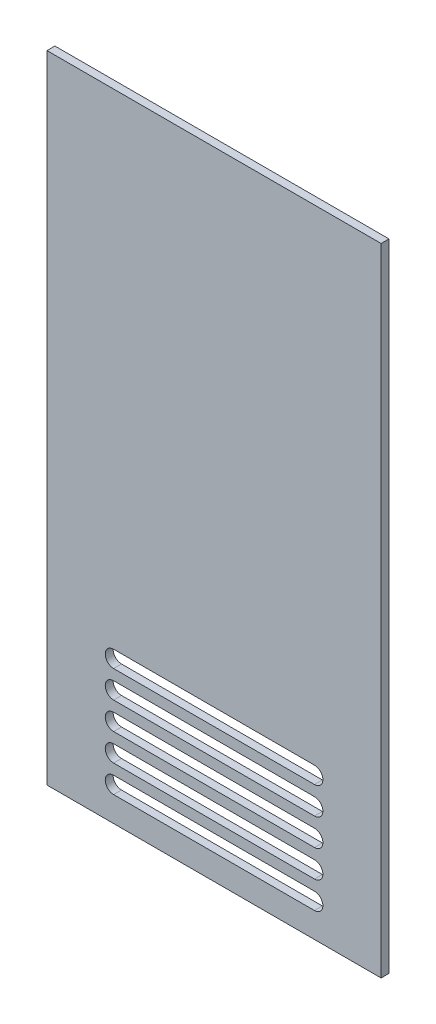
ISO-10303-21;
HEADER;
FILE_DESCRIPTION(('STEP AP214'),'2;1');
FILE_NAME('part.step','',(''),(''),'','','');
FILE_SCHEMA(('AUTOMOTIVE_DESIGN { 1 0 10303 214 1 1 1 1 }'));
ENDSEC;
DATA;
#1=APPLICATION_CONTEXT('core data for automotive mechanical design processes');
#2=APPLICATION_PROTOCOL_DEFINITION('international standard','automotive_design',2000,#1);
#3=PRODUCT_CONTEXT('',#1,'mechanical');
#4=PRODUCT('Part','Part','',(#3));
#5=PRODUCT_RELATED_PRODUCT_CATEGORY('part','',(#4));
#6=PRODUCT_DEFINITION_FORMATION('','',#4);
#7=PRODUCT_DEFINITION_CONTEXT('part definition',#1,'design');
#8=PRODUCT_DEFINITION('design','',#6,#7);
#9=PRODUCT_DEFINITION_SHAPE('','',#8);
#10=(LENGTH_UNIT() NAMED_UNIT(*) SI_UNIT(.MILLI.,.METRE.));
#11=(NAMED_UNIT(*) PLANE_ANGLE_UNIT() SI_UNIT($,.RADIAN.));
#12=(NAMED_UNIT(*) SI_UNIT($,.STERADIAN.) SOLID_ANGLE_UNIT());
#13=UNCERTAINTY_MEASURE_WITH_UNIT(LENGTH_MEASURE(1.E-05),#10,'distance_accuracy_value','');
#14=(GEOMETRIC_REPRESENTATION_CONTEXT(3) GLOBAL_UNCERTAINTY_ASSIGNED_CONTEXT((#13)) GLOBAL_UNIT_ASSIGNED_CONTEXT((#10,
#11,#12)) REPRESENTATION_CONTEXT('',''));
#15=CARTESIAN_POINT('',(0.,0.,0.));
#16=DIRECTION('',(0.,0.,1.));
#17=DIRECTION('',(1.,0.,0.));
#18=AXIS2_PLACEMENT_3D('',#15,#16,#17);
#19=CARTESIAN_POINT('',(-63.373,-120.65,2.9972));
#20=DIRECTION('',(1.,0.,0.));
#21=DIRECTION('',(0.,0.,-1.));
#22=AXIS2_PLACEMENT_3D('',#19,#20,#21);
#23=PLANE('',#22);
#24=DIRECTION('',(0.,-1.,0.));
#25=VECTOR('',#24,1.);
#26=CARTESIAN_POINT('',(-63.373,-120.65,0.));
#27=LINE('',#26,#25);
#28=CARTESIAN_POINT('',(-63.373,120.65,0.));
#29=VERTEX_POINT('',#28);
#30=CARTESIAN_POINT('',(-63.373,-120.65,0.));
#31=VERTEX_POINT('',#30);
#32=EDGE_CURVE('E246',#29,#31,#27,.T.);
#33=ORIENTED_EDGE('',*,*,#32,.T.);
#34=DIRECTION('',(0.,0.,-1.));
#35=VECTOR('',#34,1.);
#36=CARTESIAN_POINT('',(-63.373,-120.65,2.9972));
#37=LINE('',#36,#35);
#38=CARTESIAN_POINT('',(-63.373,-120.65,2.9972));
#39=VERTEX_POINT('',#38);
#40=EDGE_CURVE('E11',#39,#31,#37,.T.);
#41=ORIENTED_EDGE('',*,*,#40,.F.);
#42=DIRECTION('',(0.,-1.,0.));
#43=VECTOR('',#42,1.);
#44=CARTESIAN_POINT('',(-63.373,-120.65,2.9972));
#45=LINE('',#44,#43);
#46=CARTESIAN_POINT('',(-63.373,120.65,2.9972));
#47=VERTEX_POINT('',#46);
#48=EDGE_CURVE('E425',#47,#39,#45,.T.);
#49=ORIENTED_EDGE('',*,*,#48,.F.);
#50=DIRECTION('',(0.,0.,-1.));
#51=VECTOR('',#50,1.);
#52=CARTESIAN_POINT('',(-63.373,120.65,2.9972));
#53=LINE('',#52,#51);
#54=EDGE_CURVE('E439',#47,#29,#53,.T.);
#55=ORIENTED_EDGE('',*,*,#54,.T.);
#56=EDGE_LOOP('',(#33,#41,#49,#55));
#57=FACE_BOUND('',#56,.T.);
#58=ADVANCED_FACE('F38',(#57),#23,.F.);
#59=CARTESIAN_POINT('',(63.373,-120.65,2.9972));
#60=DIRECTION('',(0.,1.,0.));
#61=DIRECTION('',(-1.,0.,0.));
#62=AXIS2_PLACEMENT_3D('',#59,#60,#61);
#63=PLANE('',#62);
#64=DIRECTION('',(1.,0.,0.));
#65=VECTOR('',#64,1.);
#66=CARTESIAN_POINT('',(63.373,-120.65,0.));
#67=LINE('',#66,#65);
#68=CARTESIAN_POINT('',(63.373,-120.65,0.));
#69=VERTEX_POINT('',#68);
#70=EDGE_CURVE('E443',#31,#69,#67,.T.);
#71=ORIENTED_EDGE('',*,*,#70,.T.);
#72=DIRECTION('',(0.,0.,-1.));
#73=VECTOR('',#72,1.);
#74=CARTESIAN_POINT('',(63.373,-120.65,2.9972));
#75=LINE('',#74,#73);
#76=CARTESIAN_POINT('',(63.373,-120.65,2.9972));
#77=VERTEX_POINT('',#76);
#78=EDGE_CURVE('E46',#77,#69,#75,.T.);
#79=ORIENTED_EDGE('',*,*,#78,.F.);
#80=DIRECTION('',(1.,0.,0.));
#81=VECTOR('',#80,1.);
#82=CARTESIAN_POINT('',(63.373,-120.65,2.9972));
#83=LINE('',#82,#81);
#84=EDGE_CURVE('E429',#39,#77,#83,.T.);
#85=ORIENTED_EDGE('',*,*,#84,.F.);
#86=ORIENTED_EDGE('',*,*,#40,.T.);
#87=EDGE_LOOP('',(#71,#79,#85,#86));
#88=FACE_BOUND('',#87,.T.);
#89=ADVANCED_FACE('F478',(#88),#63,.F.);
#90=CARTESIAN_POINT('',(63.373,-120.65,2.9972));
#91=DIRECTION('',(-1.,0.,0.));
#92=DIRECTION('',(0.,0.,1.));
#93=AXIS2_PLACEMENT_3D('',#90,#91,#92);
#94=PLANE('',#93);
#95=DIRECTION('',(0.,1.,0.));
#96=VECTOR('',#95,1.);
#97=CARTESIAN_POINT('',(63.373,-120.65,0.));
#98=LINE('',#97,#96);
#99=CARTESIAN_POINT('',(63.373,120.65,0.));
#100=VERTEX_POINT('',#99);
#101=EDGE_CURVE('E446',#69,#100,#98,.T.);
#102=ORIENTED_EDGE('',*,*,#101,.T.);
#103=DIRECTION('',(0.,0.,-1.));
#104=VECTOR('',#103,1.);
#105=CARTESIAN_POINT('',(63.373,120.65,2.9972));
#106=LINE('',#105,#104);
#107=CARTESIAN_POINT('',(63.373,120.65,2.9972));
#108=VERTEX_POINT('',#107);
#109=EDGE_CURVE('E454',#108,#100,#106,.T.);
#110=ORIENTED_EDGE('',*,*,#109,.F.);
#111=DIRECTION('',(0.,1.,0.));
#112=VECTOR('',#111,1.);
#113=CARTESIAN_POINT('',(63.373,-120.65,2.9972));
#114=LINE('',#113,#112);
#115=EDGE_CURVE('E433',#77,#108,#114,.T.);
#116=ORIENTED_EDGE('',*,*,#115,.F.);
#117=ORIENTED_EDGE('',*,*,#78,.T.);
#118=EDGE_LOOP('',(#102,#110,#116,#117));
#119=FACE_BOUND('',#118,.T.);
#120=ADVANCED_FACE('F463',(#119),#94,.F.);
#121=CARTESIAN_POINT('',(63.373,120.65,2.9972));
#122=DIRECTION('',(0.,-1.,0.));
#123=DIRECTION('',(1.,0.,0.));
#124=AXIS2_PLACEMENT_3D('',#121,#122,#123);
#125=PLANE('',#124);
#126=DIRECTION('',(-1.,0.,0.));
#127=VECTOR('',#126,1.);
#128=CARTESIAN_POINT('',(63.373,120.65,0.));
#129=LINE('',#128,#127);
#130=EDGE_CURVE('E430',#100,#29,#129,.T.);
#131=ORIENTED_EDGE('',*,*,#130,.T.);
#132=ORIENTED_EDGE('',*,*,#54,.F.);
#133=DIRECTION('',(-1.,0.,0.));
#134=VECTOR('',#133,1.);
#135=CARTESIAN_POINT('',(63.373,120.65,2.9972));
#136=LINE('',#135,#134);
#137=EDGE_CURVE('E436',#108,#47,#136,.T.);
#138=ORIENTED_EDGE('',*,*,#137,.F.);
#139=ORIENTED_EDGE('',*,*,#109,.T.);
#140=EDGE_LOOP('',(#131,#132,#138,#139));
#141=FACE_BOUND('',#140,.T.);
#142=ADVANCED_FACE('F471',(#141),#125,.F.);
#143=CARTESIAN_POINT('',(0.,0.,2.9972));
#144=DIRECTION('',(0.,0.,1.));
#145=DIRECTION('',(1.,0.,0.));
#146=AXIS2_PLACEMENT_3D('',#143,#144,#145);
#147=PLANE('',#146);
#148=CARTESIAN_POINT('',(-38.1,-66.55,2.9972));
#149=DIRECTION('',(0.,0.,1.));
#150=DIRECTION('',(1.,0.,0.));
#151=AXIS2_PLACEMENT_3D('',#148,#149,#150);
#152=CIRCLE('',#151,3.17500000000001);
#153=CARTESIAN_POINT('',(-38.1,-63.375,2.9972));
#154=VERTEX_POINT('',#153);
#155=CARTESIAN_POINT('',(-38.1,-69.725,2.9972));
#156=VERTEX_POINT('',#155);
#157=EDGE_CURVE('E53',#154,#156,#152,.T.);
#158=ORIENTED_EDGE('',*,*,#157,.F.);
#159=DIRECTION('',(-1.,0.,0.));
#160=VECTOR('',#159,1.);
#161=CARTESIAN_POINT('',(-38.1,-63.375,2.9972));
#162=LINE('',#161,#160);
#163=CARTESIAN_POINT('',(38.1,-63.375,2.9972));
#164=VERTEX_POINT('',#163);
#165=EDGE_CURVE('E223',#164,#154,#162,.T.);
#166=ORIENTED_EDGE('',*,*,#165,.F.);
#167=CARTESIAN_POINT('',(38.1,-66.55,2.9972));
#168=DIRECTION('',(0.,0.,1.));
#169=DIRECTION('',(1.,0.,0.));
#170=AXIS2_PLACEMENT_3D('',#167,#168,#169);
#171=CIRCLE('',#170,3.175);
#172=CARTESIAN_POINT('',(38.1,-69.725,2.9972));
#173=VERTEX_POINT('',#172);
#174=EDGE_CURVE('E227',#173,#164,#171,.T.);
#175=ORIENTED_EDGE('',*,*,#174,.F.);
#176=DIRECTION('',(1.,0.,0.));
#177=VECTOR('',#176,1.);
#178=CARTESIAN_POINT('',(-38.1,-69.725,2.9972));
#179=LINE('',#178,#177);
#180=EDGE_CURVE('E236',#156,#173,#179,.T.);
#181=ORIENTED_EDGE('',*,*,#180,.F.);
#182=EDGE_LOOP('',(#158,#166,#175,#181));
#183=FACE_BOUND('',#182,.T.);
#184=CARTESIAN_POINT('',(-38.1,-97.6,2.9972));
#185=DIRECTION('',(0.,0.,1.));
#186=DIRECTION('',(1.,0.,0.));
#187=AXIS2_PLACEMENT_3D('',#184,#185,#186);
#188=CIRCLE('',#187,3.175);
#189=CARTESIAN_POINT('',(-38.1,-94.425,2.9972));
#190=VERTEX_POINT('',#189);
#191=CARTESIAN_POINT('',(-38.1,-100.775,2.9972));
#192=VERTEX_POINT('',#191);
#193=EDGE_CURVE('E61',#190,#192,#188,.T.);
#194=ORIENTED_EDGE('',*,*,#193,.F.);
#195=DIRECTION('',(-1.,0.,0.));
#196=VECTOR('',#195,1.);
#197=CARTESIAN_POINT('',(-38.1,-94.425,2.9972));
#198=LINE('',#197,#196);
#199=CARTESIAN_POINT('',(38.1,-94.425,2.9972));
#200=VERTEX_POINT('',#199);
#201=EDGE_CURVE('E303',#200,#190,#198,.T.);
#202=ORIENTED_EDGE('',*,*,#201,.F.);
#203=CARTESIAN_POINT('',(38.1,-97.6,2.9972));
#204=DIRECTION('',(0.,0.,1.));
#205=DIRECTION('',(1.,0.,0.));
#206=AXIS2_PLACEMENT_3D('',#203,#204,#205);
#207=CIRCLE('',#206,3.175);
#208=CARTESIAN_POINT('',(38.1,-100.775,2.9972));
#209=VERTEX_POINT('',#208);
#210=EDGE_CURVE('E322',#209,#200,#207,.T.);
#211=ORIENTED_EDGE('',*,*,#210,.F.);
#212=DIRECTION('',(1.,0.,0.));
#213=VECTOR('',#212,1.);
#214=CARTESIAN_POINT('',(-38.1,-100.775,2.9972));
#215=LINE('',#214,#213);
#216=EDGE_CURVE('E318',#192,#209,#215,.T.);
#217=ORIENTED_EDGE('',*,*,#216,.F.);
#218=EDGE_LOOP('',(#194,#202,#211,#217));
#219=FACE_BOUND('',#218,.T.);
#220=CARTESIAN_POINT('',(-38.1,-76.9,2.9972));
#221=DIRECTION('',(0.,0.,1.));
#222=DIRECTION('',(1.,0.,0.));
#223=AXIS2_PLACEMENT_3D('',#220,#221,#222);
#224=CIRCLE('',#223,3.17500000000001);
#225=CARTESIAN_POINT('',(-38.1,-73.725,2.9972));
#226=VERTEX_POINT('',#225);
#227=CARTESIAN_POINT('',(-38.1,-80.075,2.9972));
#228=VERTEX_POINT('',#227);
#229=EDGE_CURVE('E270',#226,#228,#224,.T.);
#230=ORIENTED_EDGE('',*,*,#229,.F.);
#231=DIRECTION('',(-1.,0.,0.));
#232=VECTOR('',#231,1.);
#233=CARTESIAN_POINT('',(-38.1,-73.725,2.9972));
#234=LINE('',#233,#232);
#235=CARTESIAN_POINT('',(38.1,-73.725,2.9972));
#236=VERTEX_POINT('',#235);
#237=EDGE_CURVE('E257',#236,#226,#234,.T.);
#238=ORIENTED_EDGE('',*,*,#237,.F.);
#239=CARTESIAN_POINT('',(38.1,-76.9,2.9972));
#240=DIRECTION('',(0.,0.,1.));
#241=DIRECTION('',(1.,0.,0.));
#242=AXIS2_PLACEMENT_3D('',#239,#240,#241);
#243=CIRCLE('',#242,3.17500000000001);
#244=CARTESIAN_POINT('',(38.1,-80.075,2.9972));
#245=VERTEX_POINT('',#244);
#246=EDGE_CURVE('E278',#245,#236,#243,.T.);
#247=ORIENTED_EDGE('',*,*,#246,.F.);
#248=DIRECTION('',(1.,0.,0.));
#249=VECTOR('',#248,1.);
#250=CARTESIAN_POINT('',(-38.1,-80.075,2.9972));
#251=LINE('',#250,#249);
#252=EDGE_CURVE('E273',#228,#245,#251,.T.);
#253=ORIENTED_EDGE('',*,*,#252,.F.);
#254=EDGE_LOOP('',(#230,#238,#247,#253));
#255=FACE_BOUND('',#254,.T.);
#256=CARTESIAN_POINT('',(-38.1,-107.95,2.9972));
#257=DIRECTION('',(0.,0.,1.));
#258=DIRECTION('',(1.,0.,0.));
#259=AXIS2_PLACEMENT_3D('',#256,#257,#258);
#260=CIRCLE('',#259,3.175);
#261=CARTESIAN_POINT('',(-38.1,-104.775,2.9972));
#262=VERTEX_POINT('',#261);
#263=CARTESIAN_POINT('',(-38.1,-111.125,2.9972));
#264=VERTEX_POINT('',#263);
#265=EDGE_CURVE('E288',#262,#264,#260,.T.);
#266=ORIENTED_EDGE('',*,*,#265,.F.);
#267=DIRECTION('',(-1.,0.,0.));
#268=VECTOR('',#267,1.);
#269=CARTESIAN_POINT('',(-38.1,-104.775,2.9972));
#270=LINE('',#269,#268);
#271=CARTESIAN_POINT('',(38.1,-104.775,2.9972));
#272=VERTEX_POINT('',#271);
#273=EDGE_CURVE('E388',#272,#262,#270,.T.);
#274=ORIENTED_EDGE('',*,*,#273,.F.);
#275=CARTESIAN_POINT('',(38.1,-107.95,2.9972));
#276=DIRECTION('',(0.,0.,1.));
#277=DIRECTION('',(1.,0.,0.));
#278=AXIS2_PLACEMENT_3D('',#275,#276,#277);
#279=CIRCLE('',#278,3.175);
#280=CARTESIAN_POINT('',(38.1,-111.125,2.9972));
#281=VERTEX_POINT('',#280);
#282=EDGE_CURVE('E407',#281,#272,#279,.T.);
#283=ORIENTED_EDGE('',*,*,#282,.F.);
#284=DIRECTION('',(1.,0.,0.));
#285=VECTOR('',#284,1.);
#286=CARTESIAN_POINT('',(-38.1,-111.125,2.9972));
#287=LINE('',#286,#285);
#288=EDGE_CURVE('E403',#264,#281,#287,.T.);
#289=ORIENTED_EDGE('',*,*,#288,.F.);
#290=EDGE_LOOP('',(#266,#274,#283,#289));
#291=FACE_BOUND('',#290,.T.);
#292=CARTESIAN_POINT('',(-38.1,-87.25,2.9972));
#293=DIRECTION('',(0.,0.,1.));
#294=DIRECTION('',(1.,0.,0.));
#295=AXIS2_PLACEMENT_3D('',#292,#293,#294);
#296=CIRCLE('',#295,3.17500000000001);
#297=CARTESIAN_POINT('',(-38.1,-84.075,2.9972));
#298=VERTEX_POINT('',#297);
#299=CARTESIAN_POINT('',(-38.1,-90.425,2.9972));
#300=VERTEX_POINT('',#299);
#301=EDGE_CURVE('E357',#298,#300,#296,.T.);
#302=ORIENTED_EDGE('',*,*,#301,.F.);
#303=DIRECTION('',(-1.,0.,0.));
#304=VECTOR('',#303,1.);
#305=CARTESIAN_POINT('',(-38.1,-84.075,2.9972));
#306=LINE('',#305,#304);
#307=CARTESIAN_POINT('',(38.1,-84.075,2.9972));
#308=VERTEX_POINT('',#307);
#309=EDGE_CURVE('E344',#308,#298,#306,.T.);
#310=ORIENTED_EDGE('',*,*,#309,.F.);
#311=CARTESIAN_POINT('',(38.1,-87.25,2.9972));
#312=DIRECTION('',(0.,0.,1.));
#313=DIRECTION('',(1.,0.,0.));
#314=AXIS2_PLACEMENT_3D('',#311,#312,#313);
#315=CIRCLE('',#314,3.17500000000001);
#316=CARTESIAN_POINT('',(38.1,-90.425,2.9972));
#317=VERTEX_POINT('',#316);
#318=EDGE_CURVE('E365',#317,#308,#315,.T.);
#319=ORIENTED_EDGE('',*,*,#318,.F.);
#320=DIRECTION('',(1.,0.,0.));
#321=VECTOR('',#320,1.);
#322=CARTESIAN_POINT('',(-38.1,-90.425,2.9972));
#323=LINE('',#322,#321);
#324=EDGE_CURVE('E360',#300,#317,#323,.T.);
#325=ORIENTED_EDGE('',*,*,#324,.F.);
#326=EDGE_LOOP('',(#302,#310,#319,#325));
#327=FACE_BOUND('',#326,.T.);
#328=ORIENTED_EDGE('',*,*,#48,.T.);
#329=ORIENTED_EDGE('',*,*,#84,.T.);
#330=ORIENTED_EDGE('',*,*,#115,.T.);
#331=ORIENTED_EDGE('',*,*,#137,.T.);
#332=EDGE_LOOP('',(#328,#329,#330,#331));
#333=FACE_BOUND('',#332,.T.);
#334=ADVANCED_FACE('F477',(#183,#219,#255,#291,#327,#333),#147,.T.);
#335=CARTESIAN_POINT('',(0.,0.,0.));
#336=DIRECTION('',(0.,0.,1.));
#337=DIRECTION('',(1.,0.,0.));
#338=AXIS2_PLACEMENT_3D('',#335,#336,#337);
#339=PLANE('',#338);
#340=DIRECTION('',(-1.,0.,0.));
#341=VECTOR('',#340,1.);
#342=CARTESIAN_POINT('',(-38.1,-63.375,0.));
#343=LINE('',#342,#341);
#344=CARTESIAN_POINT('',(38.1,-63.375,0.));
#345=VERTEX_POINT('',#344);
#346=CARTESIAN_POINT('',(-38.1,-63.375,0.));
#347=VERTEX_POINT('',#346);
#348=EDGE_CURVE('E208',#345,#347,#343,.T.);
#349=ORIENTED_EDGE('',*,*,#348,.T.);
#350=CARTESIAN_POINT('',(-38.1,-66.55,0.));
#351=DIRECTION('',(0.,0.,1.));
#352=DIRECTION('',(1.,0.,0.));
#353=AXIS2_PLACEMENT_3D('',#350,#351,#352);
#354=CIRCLE('',#353,3.17500000000001);
#355=CARTESIAN_POINT('',(-38.1,-69.725,0.));
#356=VERTEX_POINT('',#355);
#357=EDGE_CURVE('E201',#347,#356,#354,.T.);
#358=ORIENTED_EDGE('',*,*,#357,.T.);
#359=DIRECTION('',(1.,0.,0.));
#360=VECTOR('',#359,1.);
#361=CARTESIAN_POINT('',(-38.1,-69.725,0.));
#362=LINE('',#361,#360);
#363=CARTESIAN_POINT('',(38.1,-69.725,0.));
#364=VERTEX_POINT('',#363);
#365=EDGE_CURVE('E212',#356,#364,#362,.T.);
#366=ORIENTED_EDGE('',*,*,#365,.T.);
#367=CARTESIAN_POINT('',(38.1,-66.55,0.));
#368=DIRECTION('',(0.,0.,1.));
#369=DIRECTION('',(1.,0.,0.));
#370=AXIS2_PLACEMENT_3D('',#367,#368,#369);
#371=CIRCLE('',#370,3.175);
#372=EDGE_CURVE('E217',#364,#345,#371,.T.);
#373=ORIENTED_EDGE('',*,*,#372,.T.);
#374=EDGE_LOOP('',(#349,#358,#366,#373));
#375=FACE_BOUND('',#374,.T.);
#376=DIRECTION('',(-1.,0.,0.));
#377=VECTOR('',#376,1.);
#378=CARTESIAN_POINT('',(-38.1,-94.425,0.));
#379=LINE('',#378,#377);
#380=CARTESIAN_POINT('',(38.1,-94.425,0.));
#381=VERTEX_POINT('',#380);
#382=CARTESIAN_POINT('',(-38.1,-94.425,0.));
#383=VERTEX_POINT('',#382);
#384=EDGE_CURVE('E311',#381,#383,#379,.T.);
#385=ORIENTED_EDGE('',*,*,#384,.T.);
#386=CARTESIAN_POINT('',(-38.1,-97.6,0.));
#387=DIRECTION('',(0.,0.,1.));
#388=DIRECTION('',(1.,0.,0.));
#389=AXIS2_PLACEMENT_3D('',#386,#387,#388);
#390=CIRCLE('',#389,3.175);
#391=CARTESIAN_POINT('',(-38.1,-100.775,0.));
#392=VERTEX_POINT('',#391);
#393=EDGE_CURVE('E298',#383,#392,#390,.T.);
#394=ORIENTED_EDGE('',*,*,#393,.T.);
#395=DIRECTION('',(1.,0.,0.));
#396=VECTOR('',#395,1.);
#397=CARTESIAN_POINT('',(-38.1,-100.775,0.));
#398=LINE('',#397,#396);
#399=CARTESIAN_POINT('',(38.1,-100.775,0.));
#400=VERTEX_POINT('',#399);
#401=EDGE_CURVE('E302',#392,#400,#398,.T.);
#402=ORIENTED_EDGE('',*,*,#401,.T.);
#403=CARTESIAN_POINT('',(38.1,-97.6,0.));
#404=DIRECTION('',(0.,0.,1.));
#405=DIRECTION('',(1.,0.,0.));
#406=AXIS2_PLACEMENT_3D('',#403,#404,#405);
#407=CIRCLE('',#406,3.175);
#408=EDGE_CURVE('E307',#400,#381,#407,.T.);
#409=ORIENTED_EDGE('',*,*,#408,.T.);
#410=EDGE_LOOP('',(#385,#394,#402,#409));
#411=FACE_BOUND('',#410,.T.);
#412=DIRECTION('',(-1.,0.,0.));
#413=VECTOR('',#412,1.);
#414=CARTESIAN_POINT('',(-38.1,-73.725,0.));
#415=LINE('',#414,#413);
#416=CARTESIAN_POINT('',(38.1,-73.725,0.));
#417=VERTEX_POINT('',#416);
#418=CARTESIAN_POINT('',(-38.1,-73.725,0.));
#419=VERTEX_POINT('',#418);
#420=EDGE_CURVE('E265',#417,#419,#415,.T.);
#421=ORIENTED_EDGE('',*,*,#420,.T.);
#422=CARTESIAN_POINT('',(-38.1,-76.9,0.));
#423=DIRECTION('',(0.,0.,1.));
#424=DIRECTION('',(1.,0.,0.));
#425=AXIS2_PLACEMENT_3D('',#422,#423,#424);
#426=CIRCLE('',#425,3.17500000000001);
#427=CARTESIAN_POINT('',(-38.1,-80.075,0.));
#428=VERTEX_POINT('',#427);
#429=EDGE_CURVE('E252',#419,#428,#426,.T.);
#430=ORIENTED_EDGE('',*,*,#429,.T.);
#431=DIRECTION('',(1.,0.,0.));
#432=VECTOR('',#431,1.);
#433=CARTESIAN_POINT('',(-38.1,-80.075,0.));
#434=LINE('',#433,#432);
#435=CARTESIAN_POINT('',(38.1,-80.075,0.));
#436=VERTEX_POINT('',#435);
#437=EDGE_CURVE('E256',#428,#436,#434,.T.);
#438=ORIENTED_EDGE('',*,*,#437,.T.);
#439=CARTESIAN_POINT('',(38.1,-76.9,0.));
#440=DIRECTION('',(0.,0.,1.));
#441=DIRECTION('',(1.,0.,0.));
#442=AXIS2_PLACEMENT_3D('',#439,#440,#441);
#443=CIRCLE('',#442,3.17500000000001);
#444=EDGE_CURVE('E261',#436,#417,#443,.T.);
#445=ORIENTED_EDGE('',*,*,#444,.T.);
#446=EDGE_LOOP('',(#421,#430,#438,#445));
#447=FACE_BOUND('',#446,.T.);
#448=DIRECTION('',(-1.,0.,0.));
#449=VECTOR('',#448,1.);
#450=CARTESIAN_POINT('',(-38.1,-104.775,0.));
#451=LINE('',#450,#449);
#452=CARTESIAN_POINT('',(38.1,-104.775,0.));
#453=VERTEX_POINT('',#452);
#454=CARTESIAN_POINT('',(-38.1,-104.775,0.));
#455=VERTEX_POINT('',#454);
#456=EDGE_CURVE('E396',#453,#455,#451,.T.);
#457=ORIENTED_EDGE('',*,*,#456,.T.);
#458=CARTESIAN_POINT('',(-38.1,-107.95,0.));
#459=DIRECTION('',(0.,0.,1.));
#460=DIRECTION('',(1.,0.,0.));
#461=AXIS2_PLACEMENT_3D('',#458,#459,#460);
#462=CIRCLE('',#461,3.175);
#463=CARTESIAN_POINT('',(-38.1,-111.125,0.));
#464=VERTEX_POINT('',#463);
#465=EDGE_CURVE('E383',#455,#464,#462,.T.);
#466=ORIENTED_EDGE('',*,*,#465,.T.);
#467=DIRECTION('',(1.,0.,0.));
#468=VECTOR('',#467,1.);
#469=CARTESIAN_POINT('',(-38.1,-111.125,0.));
#470=LINE('',#469,#468);
#471=CARTESIAN_POINT('',(38.1,-111.125,0.));
#472=VERTEX_POINT('',#471);
#473=EDGE_CURVE('E387',#464,#472,#470,.T.);
#474=ORIENTED_EDGE('',*,*,#473,.T.);
#475=CARTESIAN_POINT('',(38.1,-107.95,0.));
#476=DIRECTION('',(0.,0.,1.));
#477=DIRECTION('',(1.,0.,0.));
#478=AXIS2_PLACEMENT_3D('',#475,#476,#477);
#479=CIRCLE('',#478,3.175);
#480=EDGE_CURVE('E392',#472,#453,#479,.T.);
#481=ORIENTED_EDGE('',*,*,#480,.T.);
#482=EDGE_LOOP('',(#457,#466,#474,#481));
#483=FACE_BOUND('',#482,.T.);
#484=DIRECTION('',(-1.,0.,0.));
#485=VECTOR('',#484,1.);
#486=CARTESIAN_POINT('',(-38.1,-84.075,0.));
#487=LINE('',#486,#485);
#488=CARTESIAN_POINT('',(38.1,-84.075,0.));
#489=VERTEX_POINT('',#488);
#490=CARTESIAN_POINT('',(-38.1,-84.075,0.));
#491=VERTEX_POINT('',#490);
#492=EDGE_CURVE('E352',#489,#491,#487,.T.);
#493=ORIENTED_EDGE('',*,*,#492,.T.);
#494=CARTESIAN_POINT('',(-38.1,-87.25,0.));
#495=DIRECTION('',(0.,0.,1.));
#496=DIRECTION('',(1.,0.,0.));
#497=AXIS2_PLACEMENT_3D('',#494,#495,#496);
#498=CIRCLE('',#497,3.17500000000001);
#499=CARTESIAN_POINT('',(-38.1,-90.425,0.));
#500=VERTEX_POINT('',#499);
#501=EDGE_CURVE('E339',#491,#500,#498,.T.);
#502=ORIENTED_EDGE('',*,*,#501,.T.);
#503=DIRECTION('',(1.,0.,0.));
#504=VECTOR('',#503,1.);
#505=CARTESIAN_POINT('',(-38.1,-90.425,0.));
#506=LINE('',#505,#504);
#507=CARTESIAN_POINT('',(38.1,-90.425,0.));
#508=VERTEX_POINT('',#507);
#509=EDGE_CURVE('E343',#500,#508,#506,.T.);
#510=ORIENTED_EDGE('',*,*,#509,.T.);
#511=CARTESIAN_POINT('',(38.1,-87.25,0.));
#512=DIRECTION('',(0.,0.,1.));
#513=DIRECTION('',(1.,0.,0.));
#514=AXIS2_PLACEMENT_3D('',#511,#512,#513);
#515=CIRCLE('',#514,3.17500000000001);
#516=EDGE_CURVE('E348',#508,#489,#515,.T.);
#517=ORIENTED_EDGE('',*,*,#516,.T.);
#518=EDGE_LOOP('',(#493,#502,#510,#517));
#519=FACE_BOUND('',#518,.T.);
#520=ORIENTED_EDGE('',*,*,#32,.F.);
#521=ORIENTED_EDGE('',*,*,#130,.F.);
#522=ORIENTED_EDGE('',*,*,#101,.F.);
#523=ORIENTED_EDGE('',*,*,#70,.F.);
#524=EDGE_LOOP('',(#520,#521,#522,#523));
#525=FACE_BOUND('',#524,.T.);
#526=ADVANCED_FACE('F219',(#375,#411,#447,#483,#519,#525),#339,.F.);
#527=CARTESIAN_POINT('',(-38.1,-87.25,0.));
#528=DIRECTION('',(0.,0.,1.));
#529=DIRECTION('',(1.,0.,0.));
#530=AXIS2_PLACEMENT_3D('',#527,#528,#529);
#531=CYLINDRICAL_SURFACE('',#530,3.17500000000001);
#532=ORIENTED_EDGE('',*,*,#301,.T.);
#533=DIRECTION('',(0.,0.,1.));
#534=VECTOR('',#533,1.);
#535=CARTESIAN_POINT('',(-38.1,-90.425,0.));
#536=LINE('',#535,#534);
#537=EDGE_CURVE('E356',#500,#300,#536,.T.);
#538=ORIENTED_EDGE('',*,*,#537,.F.);
#539=ORIENTED_EDGE('',*,*,#501,.F.);
#540=DIRECTION('',(0.,0.,1.));
#541=VECTOR('',#540,1.);
#542=CARTESIAN_POINT('',(-38.1,-84.075,0.));
#543=LINE('',#542,#541);
#544=EDGE_CURVE('E237',#491,#298,#543,.T.);
#545=ORIENTED_EDGE('',*,*,#544,.T.);
#546=EDGE_LOOP('',(#532,#538,#539,#545));
#547=FACE_BOUND('',#546,.T.);
#548=ADVANCED_FACE('F490',(#547),#531,.F.);
#549=CARTESIAN_POINT('',(-38.1,-84.075,0.));
#550=DIRECTION('',(0.,1.,0.));
#551=DIRECTION('',(-1.,0.,0.));
#552=AXIS2_PLACEMENT_3D('',#549,#550,#551);
#553=PLANE('',#552);
#554=ORIENTED_EDGE('',*,*,#309,.T.);
#555=ORIENTED_EDGE('',*,*,#544,.F.);
#556=ORIENTED_EDGE('',*,*,#492,.F.);
#557=DIRECTION('',(0.,0.,1.));
#558=VECTOR('',#557,1.);
#559=CARTESIAN_POINT('',(38.1,-84.075,0.));
#560=LINE('',#559,#558);
#561=EDGE_CURVE('E374',#489,#308,#560,.T.);
#562=ORIENTED_EDGE('',*,*,#561,.T.);
#563=EDGE_LOOP('',(#554,#555,#556,#562));
#564=FACE_BOUND('',#563,.T.);
#565=ADVANCED_FACE('F514',(#564),#553,.F.);
#566=CARTESIAN_POINT('',(38.1,-87.25,0.));
#567=DIRECTION('',(0.,0.,1.));
#568=DIRECTION('',(1.,0.,0.));
#569=AXIS2_PLACEMENT_3D('',#566,#567,#568);
#570=CYLINDRICAL_SURFACE('',#569,3.17500000000001);
#571=ORIENTED_EDGE('',*,*,#318,.T.);
#572=ORIENTED_EDGE('',*,*,#561,.F.);
#573=ORIENTED_EDGE('',*,*,#516,.F.);
#574=DIRECTION('',(0.,0.,1.));
#575=VECTOR('',#574,1.);
#576=CARTESIAN_POINT('',(38.1,-90.425,0.));
#577=LINE('',#576,#575);
#578=EDGE_CURVE('E377',#508,#317,#577,.T.);
#579=ORIENTED_EDGE('',*,*,#578,.T.);
#580=EDGE_LOOP('',(#571,#572,#573,#579));
#581=FACE_BOUND('',#580,.T.);
#582=ADVANCED_FACE('F518',(#581),#570,.F.);
#583=CARTESIAN_POINT('',(-38.1,-90.425,0.));
#584=DIRECTION('',(0.,-1.,0.));
#585=DIRECTION('',(1.,0.,0.));
#586=AXIS2_PLACEMENT_3D('',#583,#584,#585);
#587=PLANE('',#586);
#588=ORIENTED_EDGE('',*,*,#324,.T.);
#589=ORIENTED_EDGE('',*,*,#578,.F.);
#590=ORIENTED_EDGE('',*,*,#509,.F.);
#591=ORIENTED_EDGE('',*,*,#537,.T.);
#592=EDGE_LOOP('',(#588,#589,#590,#591));
#593=FACE_BOUND('',#592,.T.);
#594=ADVANCED_FACE('F498',(#593),#587,.F.);
#595=CARTESIAN_POINT('',(-38.1,-107.95,0.));
#596=DIRECTION('',(0.,0.,1.));
#597=DIRECTION('',(1.,0.,0.));
#598=AXIS2_PLACEMENT_3D('',#595,#596,#597);
#599=CYLINDRICAL_SURFACE('',#598,3.175);
#600=ORIENTED_EDGE('',*,*,#265,.T.);
#601=DIRECTION('',(0.,0.,1.));
#602=VECTOR('',#601,1.);
#603=CARTESIAN_POINT('',(-38.1,-111.125,0.));
#604=LINE('',#603,#602);
#605=EDGE_CURVE('E400',#464,#264,#604,.T.);
#606=ORIENTED_EDGE('',*,*,#605,.F.);
#607=ORIENTED_EDGE('',*,*,#465,.F.);
#608=DIRECTION('',(0.,0.,1.));
#609=VECTOR('',#608,1.);
#610=CARTESIAN_POINT('',(-38.1,-104.775,0.));
#611=LINE('',#610,#609);
#612=EDGE_CURVE('E361',#455,#262,#611,.T.);
#613=ORIENTED_EDGE('',*,*,#612,.T.);
#614=EDGE_LOOP('',(#600,#606,#607,#613));
#615=FACE_BOUND('',#614,.T.);
#616=ADVANCED_FACE('F494',(#615),#599,.F.);
#617=CARTESIAN_POINT('',(-38.1,-104.775,0.));
#618=DIRECTION('',(0.,1.,0.));
#619=DIRECTION('',(0.,0.,1.));
#620=AXIS2_PLACEMENT_3D('',#617,#618,#619);
#621=PLANE('',#620);
#622=ORIENTED_EDGE('',*,*,#273,.T.);
#623=ORIENTED_EDGE('',*,*,#612,.F.);
#624=ORIENTED_EDGE('',*,*,#456,.F.);
#625=DIRECTION('',(0.,0.,1.));
#626=VECTOR('',#625,1.);
#627=CARTESIAN_POINT('',(38.1,-104.775,0.));
#628=LINE('',#627,#626);
#629=EDGE_CURVE('E416',#453,#272,#628,.T.);
#630=ORIENTED_EDGE('',*,*,#629,.T.);
#631=EDGE_LOOP('',(#622,#623,#624,#630));
#632=FACE_BOUND('',#631,.T.);
#633=ADVANCED_FACE('F497',(#632),#621,.F.);
#634=CARTESIAN_POINT('',(38.1,-107.95,0.));
#635=DIRECTION('',(0.,0.,1.));
#636=DIRECTION('',(1.,0.,0.));
#637=AXIS2_PLACEMENT_3D('',#634,#635,#636);
#638=CYLINDRICAL_SURFACE('',#637,3.175);
#639=ORIENTED_EDGE('',*,*,#282,.T.);
#640=ORIENTED_EDGE('',*,*,#629,.F.);
#641=ORIENTED_EDGE('',*,*,#480,.F.);
#642=DIRECTION('',(0.,0.,1.));
#643=VECTOR('',#642,1.);
#644=CARTESIAN_POINT('',(38.1,-111.125,0.));
#645=LINE('',#644,#643);
#646=EDGE_CURVE('E419',#472,#281,#645,.T.);
#647=ORIENTED_EDGE('',*,*,#646,.T.);
#648=EDGE_LOOP('',(#639,#640,#641,#647));
#649=FACE_BOUND('',#648,.T.);
#650=ADVANCED_FACE('F504',(#649),#638,.F.);
#651=CARTESIAN_POINT('',(-38.1,-111.125,0.));
#652=DIRECTION('',(0.,-1.,0.));
#653=DIRECTION('',(0.,0.,-1.));
#654=AXIS2_PLACEMENT_3D('',#651,#652,#653);
#655=PLANE('',#654);
#656=ORIENTED_EDGE('',*,*,#288,.T.);
#657=ORIENTED_EDGE('',*,*,#646,.F.);
#658=ORIENTED_EDGE('',*,*,#473,.F.);
#659=ORIENTED_EDGE('',*,*,#605,.T.);
#660=EDGE_LOOP('',(#656,#657,#658,#659));
#661=FACE_BOUND('',#660,.T.);
#662=ADVANCED_FACE('F500',(#661),#655,.F.);
#663=CARTESIAN_POINT('',(-38.1,-76.9,0.));
#664=DIRECTION('',(0.,0.,1.));
#665=DIRECTION('',(1.,0.,0.));
#666=AXIS2_PLACEMENT_3D('',#663,#664,#665);
#667=CYLINDRICAL_SURFACE('',#666,3.17500000000001);
#668=ORIENTED_EDGE('',*,*,#229,.T.);
#669=DIRECTION('',(0.,0.,1.));
#670=VECTOR('',#669,1.);
#671=CARTESIAN_POINT('',(-38.1,-80.075,0.));
#672=LINE('',#671,#670);
#673=EDGE_CURVE('E269',#428,#228,#672,.T.);
#674=ORIENTED_EDGE('',*,*,#673,.F.);
#675=ORIENTED_EDGE('',*,*,#429,.F.);
#676=DIRECTION('',(0.,0.,1.));
#677=VECTOR('',#676,1.);
#678=CARTESIAN_POINT('',(-38.1,-73.725,0.));
#679=LINE('',#678,#677);
#680=EDGE_CURVE('E285',#419,#226,#679,.T.);
#681=ORIENTED_EDGE('',*,*,#680,.T.);
#682=EDGE_LOOP('',(#668,#674,#675,#681));
#683=FACE_BOUND('',#682,.T.);
#684=ADVANCED_FACE('F503',(#683),#667,.F.);
#685=CARTESIAN_POINT('',(-38.1,-73.725,0.));
#686=DIRECTION('',(0.,1.,0.));
#687=DIRECTION('',(-1.,0.,0.));
#688=AXIS2_PLACEMENT_3D('',#685,#686,#687);
#689=PLANE('',#688);
#690=ORIENTED_EDGE('',*,*,#237,.T.);
#691=ORIENTED_EDGE('',*,*,#680,.F.);
#692=ORIENTED_EDGE('',*,*,#420,.F.);
#693=DIRECTION('',(0.,0.,1.));
#694=VECTOR('',#693,1.);
#695=CARTESIAN_POINT('',(38.1,-73.725,0.));
#696=LINE('',#695,#694);
#697=EDGE_CURVE('E289',#417,#236,#696,.T.);
#698=ORIENTED_EDGE('',*,*,#697,.T.);
#699=EDGE_LOOP('',(#690,#691,#692,#698));
#700=FACE_BOUND('',#699,.T.);
#701=ADVANCED_FACE('F544',(#700),#689,.F.);
#702=CARTESIAN_POINT('',(38.1,-76.9,0.));
#703=DIRECTION('',(0.,0.,1.));
#704=DIRECTION('',(1.,0.,0.));
#705=AXIS2_PLACEMENT_3D('',#702,#703,#704);
#706=CYLINDRICAL_SURFACE('',#705,3.17500000000001);
#707=ORIENTED_EDGE('',*,*,#246,.T.);
#708=ORIENTED_EDGE('',*,*,#697,.F.);
#709=ORIENTED_EDGE('',*,*,#444,.F.);
#710=DIRECTION('',(0.,0.,1.));
#711=VECTOR('',#710,1.);
#712=CARTESIAN_POINT('',(38.1,-80.075,0.));
#713=LINE('',#712,#711);
#714=EDGE_CURVE('E292',#436,#245,#713,.T.);
#715=ORIENTED_EDGE('',*,*,#714,.T.);
#716=EDGE_LOOP('',(#707,#708,#709,#715));
#717=FACE_BOUND('',#716,.T.);
#718=ADVANCED_FACE('F548',(#717),#706,.F.);
#719=CARTESIAN_POINT('',(-38.1,-80.075,0.));
#720=DIRECTION('',(0.,-1.,0.));
#721=DIRECTION('',(1.,0.,0.));
#722=AXIS2_PLACEMENT_3D('',#719,#720,#721);
#723=PLANE('',#722);
#724=ORIENTED_EDGE('',*,*,#252,.T.);
#725=ORIENTED_EDGE('',*,*,#714,.F.);
#726=ORIENTED_EDGE('',*,*,#437,.F.);
#727=ORIENTED_EDGE('',*,*,#673,.T.);
#728=EDGE_LOOP('',(#724,#725,#726,#727));
#729=FACE_BOUND('',#728,.T.);
#730=ADVANCED_FACE('F530',(#729),#723,.F.);
#731=CARTESIAN_POINT('',(-38.1,-97.6,0.));
#732=DIRECTION('',(0.,0.,1.));
#733=DIRECTION('',(1.,0.,0.));
#734=AXIS2_PLACEMENT_3D('',#731,#732,#733);
#735=CYLINDRICAL_SURFACE('',#734,3.175);
#736=ORIENTED_EDGE('',*,*,#193,.T.);
#737=DIRECTION('',(0.,0.,1.));
#738=VECTOR('',#737,1.);
#739=CARTESIAN_POINT('',(-38.1,-100.775,0.));
#740=LINE('',#739,#738);
#741=EDGE_CURVE('E315',#392,#192,#740,.T.);
#742=ORIENTED_EDGE('',*,*,#741,.F.);
#743=ORIENTED_EDGE('',*,*,#393,.F.);
#744=DIRECTION('',(0.,0.,1.));
#745=VECTOR('',#744,1.);
#746=CARTESIAN_POINT('',(-38.1,-94.425,0.));
#747=LINE('',#746,#745);
#748=EDGE_CURVE('E274',#383,#190,#747,.T.);
#749=ORIENTED_EDGE('',*,*,#748,.T.);
#750=EDGE_LOOP('',(#736,#742,#743,#749));
#751=FACE_BOUND('',#750,.T.);
#752=ADVANCED_FACE('F526',(#751),#735,.F.);
#753=CARTESIAN_POINT('',(-38.1,-94.425,0.));
#754=DIRECTION('',(0.,1.,0.));
#755=DIRECTION('',(-1.,0.,0.));
#756=AXIS2_PLACEMENT_3D('',#753,#754,#755);
#757=PLANE('',#756);
#758=ORIENTED_EDGE('',*,*,#201,.T.);
#759=ORIENTED_EDGE('',*,*,#748,.F.);
#760=ORIENTED_EDGE('',*,*,#384,.F.);
#761=DIRECTION('',(0.,0.,1.));
#762=VECTOR('',#761,1.);
#763=CARTESIAN_POINT('',(38.1,-94.425,0.));
#764=LINE('',#763,#762);
#765=EDGE_CURVE('E331',#381,#200,#764,.T.);
#766=ORIENTED_EDGE('',*,*,#765,.T.);
#767=EDGE_LOOP('',(#758,#759,#760,#766));
#768=FACE_BOUND('',#767,.T.);
#769=ADVANCED_FACE('F529',(#768),#757,.F.);
#770=CARTESIAN_POINT('',(38.1,-97.6,0.));
#771=DIRECTION('',(0.,0.,1.));
#772=DIRECTION('',(1.,0.,0.));
#773=AXIS2_PLACEMENT_3D('',#770,#771,#772);
#774=CYLINDRICAL_SURFACE('',#773,3.175);
#775=ORIENTED_EDGE('',*,*,#210,.T.);
#776=ORIENTED_EDGE('',*,*,#765,.F.);
#777=ORIENTED_EDGE('',*,*,#408,.F.);
#778=DIRECTION('',(0.,0.,1.));
#779=VECTOR('',#778,1.);
#780=CARTESIAN_POINT('',(38.1,-100.775,0.));
#781=LINE('',#780,#779);
#782=EDGE_CURVE('E334',#400,#209,#781,.T.);
#783=ORIENTED_EDGE('',*,*,#782,.T.);
#784=EDGE_LOOP('',(#775,#776,#777,#783));
#785=FACE_BOUND('',#784,.T.);
#786=ADVANCED_FACE('F534',(#785),#774,.F.);
#787=CARTESIAN_POINT('',(-38.1,-100.775,0.));
#788=DIRECTION('',(0.,-1.,0.));
#789=DIRECTION('',(0.,0.,-1.));
#790=AXIS2_PLACEMENT_3D('',#787,#788,#789);
#791=PLANE('',#790);
#792=ORIENTED_EDGE('',*,*,#216,.T.);
#793=ORIENTED_EDGE('',*,*,#782,.F.);
#794=ORIENTED_EDGE('',*,*,#401,.F.);
#795=ORIENTED_EDGE('',*,*,#741,.T.);
#796=EDGE_LOOP('',(#792,#793,#794,#795));
#797=FACE_BOUND('',#796,.T.);
#798=ADVANCED_FACE('F531',(#797),#791,.F.);
#799=CARTESIAN_POINT('',(-38.1,-66.55,0.));
#800=DIRECTION('',(0.,0.,1.));
#801=DIRECTION('',(1.,0.,0.));
#802=AXIS2_PLACEMENT_3D('',#799,#800,#801);
#803=CYLINDRICAL_SURFACE('',#802,3.17500000000001);
#804=ORIENTED_EDGE('',*,*,#157,.T.);
#805=DIRECTION('',(0.,0.,1.));
#806=VECTOR('',#805,1.);
#807=CARTESIAN_POINT('',(-38.1,-69.725,0.));
#808=LINE('',#807,#806);
#809=EDGE_CURVE('E197',#356,#156,#808,.T.);
#810=ORIENTED_EDGE('',*,*,#809,.F.);
#811=ORIENTED_EDGE('',*,*,#357,.F.);
#812=DIRECTION('',(0.,0.,1.));
#813=VECTOR('',#812,1.);
#814=CARTESIAN_POINT('',(-38.1,-63.375,0.));
#815=LINE('',#814,#813);
#816=EDGE_CURVE('E243',#347,#154,#815,.T.);
#817=ORIENTED_EDGE('',*,*,#816,.T.);
#818=EDGE_LOOP('',(#804,#810,#811,#817));
#819=FACE_BOUND('',#818,.T.);
#820=ADVANCED_FACE('F199',(#819),#803,.F.);
#821=CARTESIAN_POINT('',(-38.1,-63.375,0.));
#822=DIRECTION('',(0.,1.,0.));
#823=DIRECTION('',(0.,0.,1.));
#824=AXIS2_PLACEMENT_3D('',#821,#822,#823);
#825=PLANE('',#824);
#826=ORIENTED_EDGE('',*,*,#165,.T.);
#827=ORIENTED_EDGE('',*,*,#816,.F.);
#828=ORIENTED_EDGE('',*,*,#348,.F.);
#829=DIRECTION('',(0.,0.,1.));
#830=VECTOR('',#829,1.);
#831=CARTESIAN_POINT('',(38.1,-63.375,0.));
#832=LINE('',#831,#830);
#833=EDGE_CURVE('E247',#345,#164,#832,.T.);
#834=ORIENTED_EDGE('',*,*,#833,.T.);
#835=EDGE_LOOP('',(#826,#827,#828,#834));
#836=FACE_BOUND('',#835,.T.);
#837=ADVANCED_FACE('F558',(#836),#825,.F.);
#838=CARTESIAN_POINT('',(38.1,-66.55,0.));
#839=DIRECTION('',(0.,0.,1.));
#840=DIRECTION('',(1.,0.,0.));
#841=AXIS2_PLACEMENT_3D('',#838,#839,#840);
#842=CYLINDRICAL_SURFACE('',#841,3.175);
#843=ORIENTED_EDGE('',*,*,#174,.T.);
#844=ORIENTED_EDGE('',*,*,#833,.F.);
#845=ORIENTED_EDGE('',*,*,#372,.F.);
#846=DIRECTION('',(0.,0.,1.));
#847=VECTOR('',#846,1.);
#848=CARTESIAN_POINT('',(38.1,-69.725,0.));
#849=LINE('',#848,#847);
#850=EDGE_CURVE('E207',#364,#173,#849,.T.);
#851=ORIENTED_EDGE('',*,*,#850,.T.);
#852=EDGE_LOOP('',(#843,#844,#845,#851));
#853=FACE_BOUND('',#852,.T.);
#854=ADVANCED_FACE('F561',(#853),#842,.F.);
#855=CARTESIAN_POINT('',(-38.1,-69.725,0.));
#856=DIRECTION('',(0.,-1.,0.));
#857=DIRECTION('',(1.,0.,0.));
#858=AXIS2_PLACEMENT_3D('',#855,#856,#857);
#859=PLANE('',#858);
#860=ORIENTED_EDGE('',*,*,#180,.T.);
#861=ORIENTED_EDGE('',*,*,#850,.F.);
#862=ORIENTED_EDGE('',*,*,#365,.F.);
#863=ORIENTED_EDGE('',*,*,#809,.T.);
#864=EDGE_LOOP('',(#860,#861,#862,#863));
#865=FACE_BOUND('',#864,.T.);
#866=ADVANCED_FACE('F213',(#865),#859,.F.);
#867=CLOSED_SHELL('',(#58,#89,#120,#142,#334,#526,#548,#565,#582,#594,#616,#633,#650,#662,#684,
#701,#718,#730,#752,#769,#786,#798,#820,#837,#854,#866));
#868=MANIFOLD_SOLID_BREP('B2',#867);
#869=ADVANCED_BREP_SHAPE_REPRESENTATION('',(#18,#868),#14);
#870=SHAPE_DEFINITION_REPRESENTATION(#9,#869);
ENDSEC;
END-ISO-10303-21;
